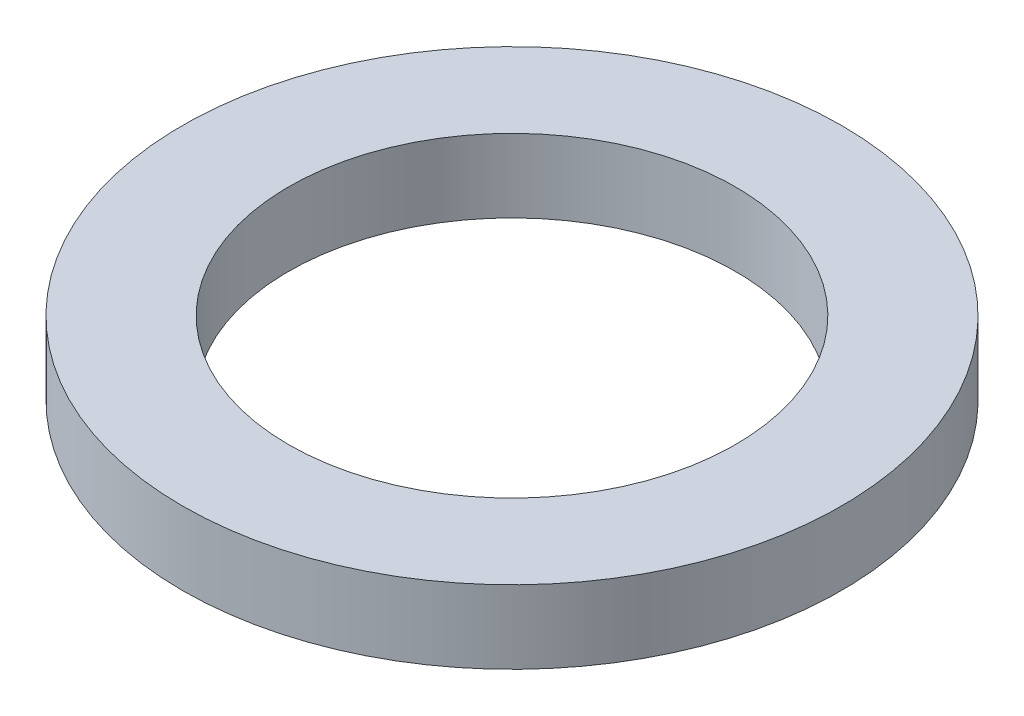
ISO-10303-21;
HEADER;
FILE_DESCRIPTION(('STEP AP214'),'2;1');
FILE_NAME('part.step','',(''),(''),'','','');
FILE_SCHEMA(('AUTOMOTIVE_DESIGN { 1 0 10303 214 1 1 1 1 }'));
ENDSEC;
DATA;
#1=APPLICATION_CONTEXT('core data for automotive mechanical design processes');
#2=APPLICATION_PROTOCOL_DEFINITION('international standard','automotive_design',2000,#1);
#3=PRODUCT_CONTEXT('',#1,'mechanical');
#4=PRODUCT('Part','Part','',(#3));
#5=PRODUCT_RELATED_PRODUCT_CATEGORY('part','',(#4));
#6=PRODUCT_DEFINITION_FORMATION('','',#4);
#7=PRODUCT_DEFINITION_CONTEXT('part definition',#1,'design');
#8=PRODUCT_DEFINITION('design','',#6,#7);
#9=PRODUCT_DEFINITION_SHAPE('','',#8);
#10=(LENGTH_UNIT() NAMED_UNIT(*) SI_UNIT(.MILLI.,.METRE.));
#11=(NAMED_UNIT(*) PLANE_ANGLE_UNIT() SI_UNIT($,.RADIAN.));
#12=(NAMED_UNIT(*) SI_UNIT($,.STERADIAN.) SOLID_ANGLE_UNIT());
#13=UNCERTAINTY_MEASURE_WITH_UNIT(LENGTH_MEASURE(1.E-05),#10,'distance_accuracy_value','');
#14=(GEOMETRIC_REPRESENTATION_CONTEXT(3) GLOBAL_UNCERTAINTY_ASSIGNED_CONTEXT((#13)) GLOBAL_UNIT_ASSIGNED_CONTEXT((#10,
#11,#12)) REPRESENTATION_CONTEXT('',''));
#15=CARTESIAN_POINT('',(0.,0.,0.));
#16=DIRECTION('',(0.,0.,1.));
#17=DIRECTION('',(1.,0.,0.));
#18=AXIS2_PLACEMENT_3D('',#15,#16,#17);
#19=CARTESIAN_POINT('',(9.0063,0.00630000000001,9.0063));
#20=DIRECTION('',(0.,1.,0.));
#21=DIRECTION('',(0.,0.,1.));
#22=AXIS2_PLACEMENT_3D('',#19,#20,#21);
#23=PLANE('',#22);
#24=CARTESIAN_POINT('',(9.0063,0.00630000000001,9.0063));
#25=DIRECTION('',(0.,1.,0.));
#26=DIRECTION('',(0.,0.,1.));
#27=AXIS2_PLACEMENT_3D('',#24,#25,#26);
#28=CIRCLE('',#27,6.1);
#29=CARTESIAN_POINT('',(9.0063,0.00630000000001,15.1063));
#30=VERTEX_POINT('',#29);
#31=EDGE_CURVE('E26',#30,#30,#28,.T.);
#32=ORIENTED_EDGE('',*,*,#31,.T.);
#33=EDGE_LOOP('',(#32));
#34=FACE_BOUND('',#33,.T.);
#35=CARTESIAN_POINT('',(9.0063,0.00630000000001,9.0063));
#36=DIRECTION('',(0.,1.,0.));
#37=DIRECTION('',(0.,0.,1.));
#38=AXIS2_PLACEMENT_3D('',#35,#36,#37);
#39=CIRCLE('',#38,9.);
#40=CARTESIAN_POINT('',(9.0063,0.00630000000001,18.0063));
#41=VERTEX_POINT('',#40);
#42=EDGE_CURVE('E17',#41,#41,#39,.T.);
#43=ORIENTED_EDGE('',*,*,#42,.F.);
#44=EDGE_LOOP('',(#43));
#45=FACE_BOUND('',#44,.T.);
#46=ADVANCED_FACE('F14',(#34,#45),#23,.F.);
#47=CARTESIAN_POINT('',(9.0063,0.00630000000001,9.0063));
#48=DIRECTION('',(0.,1.,0.));
#49=DIRECTION('',(0.,0.,1.));
#50=AXIS2_PLACEMENT_3D('',#47,#48,#49);
#51=CYLINDRICAL_SURFACE('',#50,9.);
#52=ORIENTED_EDGE('',*,*,#42,.T.);
#53=EDGE_LOOP('',(#52));
#54=FACE_BOUND('',#53,.T.);
#55=CARTESIAN_POINT('',(9.0063,2.0063,9.0063));
#56=DIRECTION('',(0.,1.,0.));
#57=DIRECTION('',(0.,0.,1.));
#58=AXIS2_PLACEMENT_3D('',#55,#56,#57);
#59=CIRCLE('',#58,9.);
#60=CARTESIAN_POINT('',(9.0063,2.0063,18.0063));
#61=VERTEX_POINT('',#60);
#62=EDGE_CURVE('E21',#61,#61,#59,.T.);
#63=ORIENTED_EDGE('',*,*,#62,.F.);
#64=EDGE_LOOP('',(#63));
#65=FACE_BOUND('',#64,.T.);
#66=ADVANCED_FACE('F34',(#54,#65),#51,.T.);
#67=CARTESIAN_POINT('',(9.0063,0.00630000000001,9.0063));
#68=DIRECTION('',(0.,1.,0.));
#69=DIRECTION('',(0.,0.,1.));
#70=AXIS2_PLACEMENT_3D('',#67,#68,#69);
#71=CYLINDRICAL_SURFACE('',#70,6.1);
#72=ORIENTED_EDGE('',*,*,#31,.F.);
#73=EDGE_LOOP('',(#72));
#74=FACE_BOUND('',#73,.T.);
#75=CARTESIAN_POINT('',(9.0063,2.0063,9.0063));
#76=DIRECTION('',(0.,1.,0.));
#77=DIRECTION('',(0.,0.,1.));
#78=AXIS2_PLACEMENT_3D('',#75,#76,#77);
#79=CIRCLE('',#78,6.1);
#80=CARTESIAN_POINT('',(9.0063,2.0063,15.1063));
#81=VERTEX_POINT('',#80);
#82=EDGE_CURVE('E10',#81,#81,#79,.F.);
#83=ORIENTED_EDGE('',*,*,#82,.F.);
#84=EDGE_LOOP('',(#83));
#85=FACE_BOUND('',#84,.T.);
#86=ADVANCED_FACE('F42',(#74,#85),#71,.F.);
#87=CARTESIAN_POINT('',(9.0063,2.0063,9.0063));
#88=DIRECTION('',(0.,1.,0.));
#89=DIRECTION('',(0.,0.,1.));
#90=AXIS2_PLACEMENT_3D('',#87,#88,#89);
#91=PLANE('',#90);
#92=ORIENTED_EDGE('',*,*,#82,.T.);
#93=EDGE_LOOP('',(#92));
#94=FACE_BOUND('',#93,.T.);
#95=ORIENTED_EDGE('',*,*,#62,.T.);
#96=EDGE_LOOP('',(#95));
#97=FACE_BOUND('',#96,.T.);
#98=ADVANCED_FACE('F43',(#94,#97),#91,.T.);
#99=CLOSED_SHELL('',(#46,#66,#86,#98));
#100=MANIFOLD_SOLID_BREP('B1',#99);
#101=ADVANCED_BREP_SHAPE_REPRESENTATION('',(#18,#100),#14);
#102=SHAPE_DEFINITION_REPRESENTATION(#9,#101);
ENDSEC;
END-ISO-10303-21;
